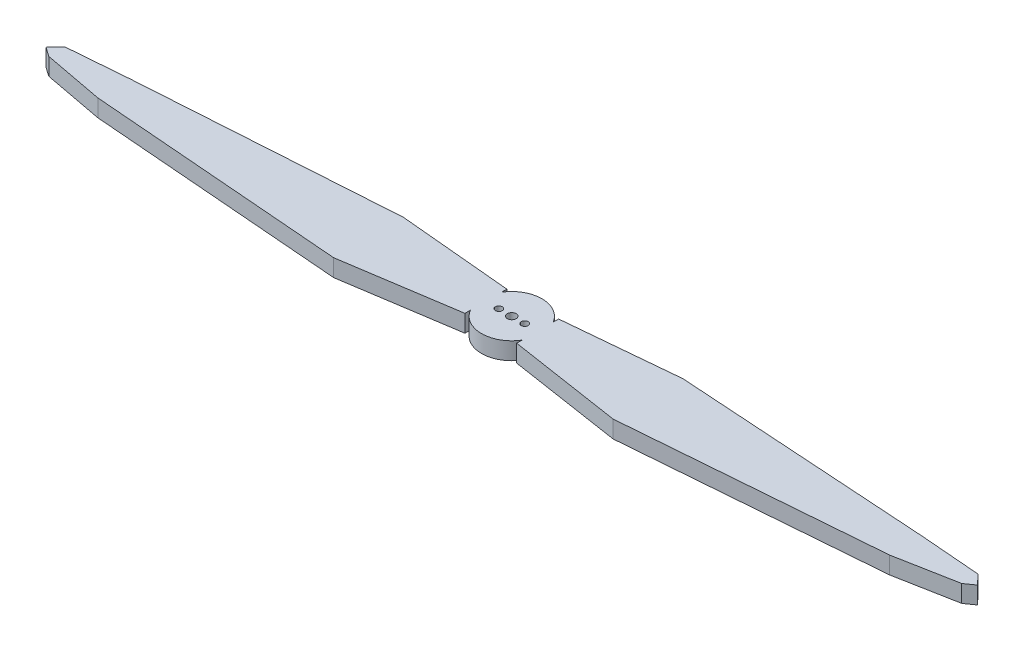
ISO-10303-21;
HEADER;
FILE_DESCRIPTION(('STEP AP214'),'2;1');
FILE_NAME('part.step','',(''),(''),'','','');
FILE_SCHEMA(('AUTOMOTIVE_DESIGN { 1 0 10303 214 1 1 1 1 }'));
ENDSEC;
DATA;
#1=APPLICATION_CONTEXT('core data for automotive mechanical design processes');
#2=APPLICATION_PROTOCOL_DEFINITION('international standard','automotive_design',2000,#1);
#3=PRODUCT_CONTEXT('',#1,'mechanical');
#4=PRODUCT('Part','Part','',(#3));
#5=PRODUCT_RELATED_PRODUCT_CATEGORY('part','',(#4));
#6=PRODUCT_DEFINITION_FORMATION('','',#4);
#7=PRODUCT_DEFINITION_CONTEXT('part definition',#1,'design');
#8=PRODUCT_DEFINITION('design','',#6,#7);
#9=PRODUCT_DEFINITION_SHAPE('','',#8);
#10=(LENGTH_UNIT() NAMED_UNIT(*) SI_UNIT(.MILLI.,.METRE.));
#11=(NAMED_UNIT(*) PLANE_ANGLE_UNIT() SI_UNIT($,.RADIAN.));
#12=(NAMED_UNIT(*) SI_UNIT($,.STERADIAN.) SOLID_ANGLE_UNIT());
#13=UNCERTAINTY_MEASURE_WITH_UNIT(LENGTH_MEASURE(1.E-05),#10,'distance_accuracy_value','');
#14=(GEOMETRIC_REPRESENTATION_CONTEXT(3) GLOBAL_UNCERTAINTY_ASSIGNED_CONTEXT((#13)) GLOBAL_UNIT_ASSIGNED_CONTEXT((#10,
#11,#12)) REPRESENTATION_CONTEXT('',''));
#15=CARTESIAN_POINT('',(0.,0.,0.));
#16=DIRECTION('',(0.,0.,1.));
#17=DIRECTION('',(1.,0.,0.));
#18=AXIS2_PLACEMENT_3D('',#15,#16,#17);
#19=CARTESIAN_POINT('',(0.,8.,0.));
#20=DIRECTION('',(0.,-1.,0.));
#21=DIRECTION('',(0.,0.,-1.));
#22=AXIS2_PLACEMENT_3D('',#19,#20,#21);
#23=CYLINDRICAL_SURFACE('',#22,14.);
#24=DIRECTION('',(0.,-1.,0.));
#25=VECTOR('',#24,1.);
#26=CARTESIAN_POINT('',(-12.,8.,-7.21110255092798));
#27=LINE('',#26,#25);
#28=CARTESIAN_POINT('',(-12.,8.,-7.21110255092798));
#29=VERTEX_POINT('',#28);
#30=CARTESIAN_POINT('',(-12.,0.,-7.21110255092798));
#31=VERTEX_POINT('',#30);
#32=EDGE_CURVE('E11',#29,#31,#27,.T.);
#33=ORIENTED_EDGE('',*,*,#32,.F.);
#34=CARTESIAN_POINT('',(0.,8.,0.));
#35=DIRECTION('',(0.,1.,0.));
#36=DIRECTION('',(0.,0.,1.));
#37=AXIS2_PLACEMENT_3D('',#34,#35,#36);
#38=CIRCLE('',#37,14.);
#39=CARTESIAN_POINT('',(12.,8.,-7.21110255092798));
#40=VERTEX_POINT('',#39);
#41=EDGE_CURVE('E241',#40,#29,#38,.T.);
#42=ORIENTED_EDGE('',*,*,#41,.F.);
#43=DIRECTION('',(0.,-1.,0.));
#44=VECTOR('',#43,1.);
#45=CARTESIAN_POINT('',(12.,8.,-7.21110255092798));
#46=LINE('',#45,#44);
#47=CARTESIAN_POINT('',(12.,0.,-7.21110255092798));
#48=VERTEX_POINT('',#47);
#49=EDGE_CURVE('E242',#40,#48,#46,.T.);
#50=ORIENTED_EDGE('',*,*,#49,.T.);
#51=CARTESIAN_POINT('',(0.,0.,0.));
#52=DIRECTION('',(0.,1.,0.));
#53=DIRECTION('',(0.,0.,1.));
#54=AXIS2_PLACEMENT_3D('',#51,#52,#53);
#55=CIRCLE('',#54,14.);
#56=EDGE_CURVE('E218',#48,#31,#55,.T.);
#57=ORIENTED_EDGE('',*,*,#56,.T.);
#58=EDGE_LOOP('',(#33,#42,#50,#57));
#59=FACE_BOUND('',#58,.T.);
#60=ADVANCED_FACE('F39',(#59),#23,.T.);
#61=DIRECTION('',(0.,-1.,0.));
#62=VECTOR('',#61,1.);
#63=CARTESIAN_POINT('',(-12.,8.,7.21110255092798));
#64=LINE('',#63,#62);
#65=CARTESIAN_POINT('',(-12.,0.,7.21110255092798));
#66=VERTEX_POINT('',#65);
#67=CARTESIAN_POINT('',(-12.,8.,7.21110255092798));
#68=VERTEX_POINT('',#67);
#69=EDGE_CURVE('E48',#66,#68,#64,.F.);
#70=ORIENTED_EDGE('',*,*,#69,.F.);
#71=CARTESIAN_POINT('',(12.,0.,7.21110255092798));
#72=VERTEX_POINT('',#71);
#73=EDGE_CURVE('E215',#66,#72,#55,.T.);
#74=ORIENTED_EDGE('',*,*,#73,.T.);
#75=DIRECTION('',(0.,-1.,0.));
#76=VECTOR('',#75,1.);
#77=CARTESIAN_POINT('',(12.,8.,7.21110255092798));
#78=LINE('',#77,#76);
#79=CARTESIAN_POINT('',(12.,8.,7.21110255092798));
#80=VERTEX_POINT('',#79);
#81=EDGE_CURVE('E246',#72,#80,#78,.F.);
#82=ORIENTED_EDGE('',*,*,#81,.T.);
#83=EDGE_CURVE('E56',#68,#80,#38,.T.);
#84=ORIENTED_EDGE('',*,*,#83,.F.);
#85=EDGE_LOOP('',(#70,#74,#82,#84));
#86=FACE_BOUND('',#85,.T.);
#87=ADVANCED_FACE('F437',(#86),#23,.T.);
#88=CARTESIAN_POINT('',(12.,8.,-9.7155));
#89=DIRECTION('',(1.,0.,0.));
#90=DIRECTION('',(0.,0.,-1.));
#91=AXIS2_PLACEMENT_3D('',#88,#89,#90);
#92=PLANE('',#91);
#93=ORIENTED_EDGE('',*,*,#81,.F.);
#94=DIRECTION('',(0.,0.,1.));
#95=VECTOR('',#94,1.);
#96=CARTESIAN_POINT('',(12.,0.,-9.7155));
#97=LINE('',#96,#95);
#98=CARTESIAN_POINT('',(12.,0.,9.7155));
#99=VERTEX_POINT('',#98);
#100=EDGE_CURVE('E248',#72,#99,#97,.T.);
#101=ORIENTED_EDGE('',*,*,#100,.T.);
#102=DIRECTION('',(0.,-1.,0.));
#103=VECTOR('',#102,1.);
#104=CARTESIAN_POINT('',(12.,8.,9.7155));
#105=LINE('',#104,#103);
#106=CARTESIAN_POINT('',(12.,8.,9.7155));
#107=VERTEX_POINT('',#106);
#108=EDGE_CURVE('E311',#107,#99,#105,.T.);
#109=ORIENTED_EDGE('',*,*,#108,.F.);
#110=DIRECTION('',(0.,0.,1.));
#111=VECTOR('',#110,1.);
#112=CARTESIAN_POINT('',(12.,8.,-9.7155));
#113=LINE('',#112,#111);
#114=EDGE_CURVE('E253',#80,#107,#113,.T.);
#115=ORIENTED_EDGE('',*,*,#114,.F.);
#116=EDGE_LOOP('',(#93,#101,#109,#115));
#117=FACE_BOUND('',#116,.T.);
#118=ADVANCED_FACE('F41',(#117),#92,.F.);
#119=ORIENTED_EDGE('',*,*,#49,.F.);
#120=CARTESIAN_POINT('',(12.,8.,-9.7155));
#121=VERTEX_POINT('',#120);
#122=EDGE_CURVE('E249',#121,#40,#113,.T.);
#123=ORIENTED_EDGE('',*,*,#122,.F.);
#124=DIRECTION('',(0.,-1.,0.));
#125=VECTOR('',#124,1.);
#126=CARTESIAN_POINT('',(12.,8.,-9.7155));
#127=LINE('',#126,#125);
#128=CARTESIAN_POINT('',(12.,0.,-9.7155));
#129=VERTEX_POINT('',#128);
#130=EDGE_CURVE('E269',#121,#129,#127,.T.);
#131=ORIENTED_EDGE('',*,*,#130,.T.);
#132=EDGE_CURVE('E270',#129,#48,#97,.T.);
#133=ORIENTED_EDGE('',*,*,#132,.T.);
#134=EDGE_LOOP('',(#119,#123,#131,#133));
#135=FACE_BOUND('',#134,.T.);
#136=ADVANCED_FACE('F393',(#135),#92,.F.);
#137=CARTESIAN_POINT('',(12.,8.,9.7155));
#138=DIRECTION('',(0.151650746893093,0.,-0.988434140935433));
#139=DIRECTION('',(-0.988434140935433,0.,-0.151650746893093));
#140=AXIS2_PLACEMENT_3D('',#137,#138,#139);
#141=PLANE('',#140);
#142=DIRECTION('',(0.988434140935433,0.,0.151650746893093));
#143=VECTOR('',#142,1.);
#144=CARTESIAN_POINT('',(12.,0.,9.7155));
#145=LINE('',#144,#143);
#146=CARTESIAN_POINT('',(64.77,0.,17.81175));
#147=VERTEX_POINT('',#146);
#148=EDGE_CURVE('E272',#99,#147,#145,.T.);
#149=ORIENTED_EDGE('',*,*,#148,.T.);
#150=DIRECTION('',(0.,-1.,0.));
#151=VECTOR('',#150,1.);
#152=CARTESIAN_POINT('',(64.77,8.,17.81175));
#153=LINE('',#152,#151);
#154=CARTESIAN_POINT('',(64.77,8.,17.81175));
#155=VERTEX_POINT('',#154);
#156=EDGE_CURVE('E308',#155,#147,#153,.T.);
#157=ORIENTED_EDGE('',*,*,#156,.F.);
#158=DIRECTION('',(0.988434140935433,0.,0.151650746893093));
#159=VECTOR('',#158,1.);
#160=CARTESIAN_POINT('',(12.,8.,9.7155));
#161=LINE('',#160,#159);
#162=EDGE_CURVE('E252',#107,#155,#161,.T.);
#163=ORIENTED_EDGE('',*,*,#162,.F.);
#164=ORIENTED_EDGE('',*,*,#108,.T.);
#165=EDGE_LOOP('',(#149,#157,#163,#164));
#166=FACE_BOUND('',#165,.T.);
#167=ADVANCED_FACE('F434',(#166),#141,.F.);
#168=CARTESIAN_POINT('',(64.77,8.,17.81175));
#169=DIRECTION('',(-0.07974522228289,0.,-0.996815278536125));
#170=DIRECTION('',(-0.996815278536125,0.,0.07974522228289));
#171=AXIS2_PLACEMENT_3D('',#168,#169,#170);
#172=PLANE('',#171);
#173=DIRECTION('',(0.996815278536125,0.,-0.07974522228289));
#174=VECTOR('',#173,1.);
#175=CARTESIAN_POINT('',(64.77,0.,17.81175));
#176=LINE('',#175,#174);
#177=CARTESIAN_POINT('',(183.515,0.,8.31215));
#178=VERTEX_POINT('',#177);
#179=EDGE_CURVE('E274',#147,#178,#176,.T.);
#180=ORIENTED_EDGE('',*,*,#179,.T.);
#181=DIRECTION('',(0.,-1.,0.));
#182=VECTOR('',#181,1.);
#183=CARTESIAN_POINT('',(183.515,8.,8.31215));
#184=LINE('',#183,#182);
#185=CARTESIAN_POINT('',(183.515,8.,8.31215));
#186=VERTEX_POINT('',#185);
#187=EDGE_CURVE('E305',#186,#178,#184,.T.);
#188=ORIENTED_EDGE('',*,*,#187,.F.);
#189=DIRECTION('',(0.996815278536125,0.,-0.07974522228289));
#190=VECTOR('',#189,1.);
#191=CARTESIAN_POINT('',(64.77,8.,17.81175));
#192=LINE('',#191,#190);
#193=EDGE_CURVE('E255',#155,#186,#192,.T.);
#194=ORIENTED_EDGE('',*,*,#193,.F.);
#195=ORIENTED_EDGE('',*,*,#156,.T.);
#196=EDGE_LOOP('',(#180,#188,#194,#195));
#197=FACE_BOUND('',#196,.T.);
#198=ADVANCED_FACE('F427',(#197),#172,.F.);
#199=CARTESIAN_POINT('',(183.515,8.,8.31215));
#200=DIRECTION('',(-0.185201268913039,0.,-0.982700610558984));
#201=DIRECTION('',(-0.982700610558984,0.,0.185201268913039));
#202=AXIS2_PLACEMENT_3D('',#199,#200,#201);
#203=PLANE('',#202);
#204=DIRECTION('',(0.982700610558984,0.,-0.185201268913039));
#205=VECTOR('',#204,1.);
#206=CARTESIAN_POINT('',(183.515,0.,8.31215));
#207=LINE('',#206,#205);
#208=CARTESIAN_POINT('',(211.582,0.,3.0226));
#209=VERTEX_POINT('',#208);
#210=EDGE_CURVE('E276',#178,#209,#207,.T.);
#211=ORIENTED_EDGE('',*,*,#210,.T.);
#212=DIRECTION('',(0.,-1.,0.));
#213=VECTOR('',#212,1.);
#214=CARTESIAN_POINT('',(211.582,8.,3.0226));
#215=LINE('',#214,#213);
#216=CARTESIAN_POINT('',(211.582,8.,3.0226));
#217=VERTEX_POINT('',#216);
#218=EDGE_CURVE('E302',#217,#209,#215,.T.);
#219=ORIENTED_EDGE('',*,*,#218,.F.);
#220=DIRECTION('',(0.982700610558984,0.,-0.185201268913039));
#221=VECTOR('',#220,1.);
#222=CARTESIAN_POINT('',(183.515,8.,8.31215));
#223=LINE('',#222,#221);
#224=EDGE_CURVE('E257',#186,#217,#223,.T.);
#225=ORIENTED_EDGE('',*,*,#224,.F.);
#226=ORIENTED_EDGE('',*,*,#187,.T.);
#227=EDGE_LOOP('',(#211,#219,#225,#226));
#228=FACE_BOUND('',#227,.T.);
#229=ADVANCED_FACE('F423',(#228),#203,.F.);
#230=CARTESIAN_POINT('',(211.582,8.,3.0226));
#231=DIRECTION('',(-0.573462344363327,0.,-0.819231920519042));
#232=DIRECTION('',(-0.819231920519042,0.,0.573462344363327));
#233=AXIS2_PLACEMENT_3D('',#230,#231,#232);
#234=PLANE('',#233);
#235=DIRECTION('',(0.819231920519041,0.,-0.573462344363327));
#236=VECTOR('',#235,1.);
#237=CARTESIAN_POINT('',(211.582,0.,3.0226));
#238=LINE('',#237,#236);
#239=CARTESIAN_POINT('',(215.9,0.,0.));
#240=VERTEX_POINT('',#239);
#241=EDGE_CURVE('E278',#209,#240,#238,.T.);
#242=ORIENTED_EDGE('',*,*,#241,.T.);
#243=DIRECTION('',(0.,-1.,0.));
#244=VECTOR('',#243,1.);
#245=CARTESIAN_POINT('',(215.9,8.,0.));
#246=LINE('',#245,#244);
#247=CARTESIAN_POINT('',(215.9,8.,0.));
#248=VERTEX_POINT('',#247);
#249=EDGE_CURVE('E299',#248,#240,#246,.T.);
#250=ORIENTED_EDGE('',*,*,#249,.F.);
#251=DIRECTION('',(0.819231920519041,0.,-0.573462344363327));
#252=VECTOR('',#251,1.);
#253=CARTESIAN_POINT('',(211.582,8.,3.0226));
#254=LINE('',#253,#252);
#255=EDGE_CURVE('E259',#217,#248,#254,.T.);
#256=ORIENTED_EDGE('',*,*,#255,.F.);
#257=ORIENTED_EDGE('',*,*,#218,.T.);
#258=EDGE_LOOP('',(#242,#250,#256,#257));
#259=FACE_BOUND('',#258,.T.);
#260=ADVANCED_FACE('F418',(#259),#234,.F.);
#261=CARTESIAN_POINT('',(215.9,8.,0.));
#262=DIRECTION('',(-0.724137931034482,0.,0.689655172413794));
#263=DIRECTION('',(0.689655172413794,0.,0.724137931034482));
#264=AXIS2_PLACEMENT_3D('',#261,#262,#263);
#265=PLANE('',#264);
#266=DIRECTION('',(-0.689655172413794,0.,-0.724137931034482));
#267=VECTOR('',#266,1.);
#268=CARTESIAN_POINT('',(215.9,0.,0.));
#269=LINE('',#268,#267);
#270=CARTESIAN_POINT('',(211.582,0.,-4.5339));
#271=VERTEX_POINT('',#270);
#272=EDGE_CURVE('E280',#240,#271,#269,.T.);
#273=ORIENTED_EDGE('',*,*,#272,.T.);
#274=DIRECTION('',(0.,-1.,0.));
#275=VECTOR('',#274,1.);
#276=CARTESIAN_POINT('',(211.582,8.,-4.5339));
#277=LINE('',#276,#275);
#278=CARTESIAN_POINT('',(211.582,8.,-4.5339));
#279=VERTEX_POINT('',#278);
#280=EDGE_CURVE('E296',#279,#271,#277,.T.);
#281=ORIENTED_EDGE('',*,*,#280,.F.);
#282=DIRECTION('',(-0.689655172413794,0.,-0.724137931034482));
#283=VECTOR('',#282,1.);
#284=CARTESIAN_POINT('',(215.9,8.,0.));
#285=LINE('',#284,#283);
#286=EDGE_CURVE('E261',#248,#279,#285,.T.);
#287=ORIENTED_EDGE('',*,*,#286,.F.);
#288=ORIENTED_EDGE('',*,*,#249,.T.);
#289=EDGE_LOOP('',(#273,#281,#287,#288));
#290=FACE_BOUND('',#289,.T.);
#291=ADVANCED_FACE('F412',(#290),#265,.F.);
#292=CARTESIAN_POINT('',(211.582,8.,-4.5339));
#293=DIRECTION('',(-0.0805070569764701,0.,0.996754038756296));
#294=DIRECTION('',(0.996754038756296,0.,0.0805070569764701));
#295=AXIS2_PLACEMENT_3D('',#292,#293,#294);
#296=PLANE('',#295);
#297=DIRECTION('',(-0.996754038756296,0.,-0.0805070569764701));
#298=VECTOR('',#297,1.);
#299=CARTESIAN_POINT('',(211.582,0.,-4.5339));
#300=LINE('',#299,#298);
#301=CARTESIAN_POINT('',(183.515,0.,-6.80085));
#302=VERTEX_POINT('',#301);
#303=EDGE_CURVE('E282',#271,#302,#300,.T.);
#304=ORIENTED_EDGE('',*,*,#303,.T.);
#305=DIRECTION('',(0.,-1.,0.));
#306=VECTOR('',#305,1.);
#307=CARTESIAN_POINT('',(183.515,8.,-6.80085));
#308=LINE('',#307,#306);
#309=CARTESIAN_POINT('',(183.515,8.,-6.80085));
#310=VERTEX_POINT('',#309);
#311=EDGE_CURVE('E293',#310,#302,#308,.T.);
#312=ORIENTED_EDGE('',*,*,#311,.F.);
#313=DIRECTION('',(-0.996754038756296,0.,-0.0805070569764701));
#314=VECTOR('',#313,1.);
#315=CARTESIAN_POINT('',(211.582,8.,-4.5339));
#316=LINE('',#315,#314);
#317=EDGE_CURVE('E263',#279,#310,#316,.T.);
#318=ORIENTED_EDGE('',*,*,#317,.F.);
#319=ORIENTED_EDGE('',*,*,#280,.T.);
#320=EDGE_LOOP('',(#304,#312,#318,#319));
#321=FACE_BOUND('',#320,.T.);
#322=ADVANCED_FACE('F408',(#321),#296,.F.);
#323=CARTESIAN_POINT('',(183.515,8.,-6.80085));
#324=DIRECTION('',(-0.0653147810154766,0.,0.99786470995867));
#325=DIRECTION('',(0.99786470995867,0.,0.0653147810154766));
#326=AXIS2_PLACEMENT_3D('',#323,#324,#325);
#327=PLANE('',#326);
#328=DIRECTION('',(-0.99786470995867,0.,-0.0653147810154766));
#329=VECTOR('',#328,1.);
#330=CARTESIAN_POINT('',(183.515,0.,-6.80085));
#331=LINE('',#330,#329);
#332=CARTESIAN_POINT('',(64.77,0.,-14.57325));
#333=VERTEX_POINT('',#332);
#334=EDGE_CURVE('E284',#302,#333,#331,.T.);
#335=ORIENTED_EDGE('',*,*,#334,.T.);
#336=DIRECTION('',(0.,-1.,0.));
#337=VECTOR('',#336,1.);
#338=CARTESIAN_POINT('',(64.77,8.,-14.57325));
#339=LINE('',#338,#337);
#340=CARTESIAN_POINT('',(64.77,8.,-14.57325));
#341=VERTEX_POINT('',#340);
#342=EDGE_CURVE('E290',#341,#333,#339,.T.);
#343=ORIENTED_EDGE('',*,*,#342,.F.);
#344=DIRECTION('',(-0.99786470995867,0.,-0.0653147810154766));
#345=VECTOR('',#344,1.);
#346=CARTESIAN_POINT('',(183.515,8.,-6.80085));
#347=LINE('',#346,#345);
#348=EDGE_CURVE('E265',#310,#341,#347,.T.);
#349=ORIENTED_EDGE('',*,*,#348,.F.);
#350=ORIENTED_EDGE('',*,*,#311,.T.);
#351=EDGE_LOOP('',(#335,#343,#349,#350));
#352=FACE_BOUND('',#351,.T.);
#353=ADVANCED_FACE('F404',(#352),#327,.F.);
#354=CARTESIAN_POINT('',(64.77,8.,-14.57325));
#355=DIRECTION('',(0.0916675620231843,0.,0.995789665578392));
#356=DIRECTION('',(0.995789665578392,0.,-0.0916675620231843));
#357=AXIS2_PLACEMENT_3D('',#354,#355,#356);
#358=PLANE('',#357);
#359=DIRECTION('',(-0.995789665578392,0.,0.0916675620231843));
#360=VECTOR('',#359,1.);
#361=CARTESIAN_POINT('',(64.77,0.,-14.57325));
#362=LINE('',#361,#360);
#363=EDGE_CURVE('E286',#333,#129,#362,.T.);
#364=ORIENTED_EDGE('',*,*,#363,.T.);
#365=ORIENTED_EDGE('',*,*,#130,.F.);
#366=DIRECTION('',(-0.995789665578392,0.,0.0916675620231843));
#367=VECTOR('',#366,1.);
#368=CARTESIAN_POINT('',(64.77,8.,-14.57325));
#369=LINE('',#368,#367);
#370=EDGE_CURVE('E267',#341,#121,#369,.T.);
#371=ORIENTED_EDGE('',*,*,#370,.F.);
#372=ORIENTED_EDGE('',*,*,#342,.T.);
#373=EDGE_LOOP('',(#364,#365,#371,#372));
#374=FACE_BOUND('',#373,.T.);
#375=ADVANCED_FACE('F399',(#374),#358,.F.);
#376=CARTESIAN_POINT('',(0.,8.,0.));
#377=DIRECTION('',(0.,-1.,0.));
#378=DIRECTION('',(0.,0.,-1.));
#379=AXIS2_PLACEMENT_3D('',#376,#377,#378);
#380=PLANE('',#379);
#381=CARTESIAN_POINT('',(-6.,8.,0.));
#382=DIRECTION('',(0.,1.,0.));
#383=DIRECTION('',(0.,0.,1.));
#384=AXIS2_PLACEMENT_3D('',#381,#382,#383);
#385=CIRCLE('',#384,1.6);
#386=CARTESIAN_POINT('',(-6.,8.,1.6));
#387=VERTEX_POINT('',#386);
#388=EDGE_CURVE('E680',#387,#387,#385,.T.);
#389=ORIENTED_EDGE('',*,*,#388,.F.);
#390=EDGE_LOOP('',(#389));
#391=FACE_BOUND('',#390,.T.);
#392=CARTESIAN_POINT('',(6.,8.,0.));
#393=DIRECTION('',(0.,1.,0.));
#394=DIRECTION('',(0.,0.,1.));
#395=AXIS2_PLACEMENT_3D('',#392,#393,#394);
#396=CIRCLE('',#395,1.6);
#397=CARTESIAN_POINT('',(6.,8.,1.6));
#398=VERTEX_POINT('',#397);
#399=EDGE_CURVE('E681',#398,#398,#396,.T.);
#400=ORIENTED_EDGE('',*,*,#399,.F.);
#401=EDGE_LOOP('',(#400));
#402=FACE_BOUND('',#401,.T.);
#403=CARTESIAN_POINT('',(0.,8.,0.));
#404=DIRECTION('',(0.,1.,0.));
#405=DIRECTION('',(0.,0.,1.));
#406=AXIS2_PLACEMENT_3D('',#403,#404,#405);
#407=CIRCLE('',#406,2.05);
#408=CARTESIAN_POINT('',(0.,8.,2.05));
#409=VERTEX_POINT('',#408);
#410=EDGE_CURVE('E318',#409,#409,#407,.T.);
#411=ORIENTED_EDGE('',*,*,#410,.F.);
#412=EDGE_LOOP('',(#411));
#413=FACE_BOUND('',#412,.T.);
#414=DIRECTION('',(0.,0.,-1.));
#415=VECTOR('',#414,1.);
#416=CARTESIAN_POINT('',(-12.,8.,-9.7155));
#417=LINE('',#416,#415);
#418=CARTESIAN_POINT('',(-12.,8.,9.7155));
#419=VERTEX_POINT('',#418);
#420=EDGE_CURVE('E203',#419,#68,#417,.T.);
#421=ORIENTED_EDGE('',*,*,#420,.T.);
#422=ORIENTED_EDGE('',*,*,#83,.T.);
#423=ORIENTED_EDGE('',*,*,#114,.T.);
#424=ORIENTED_EDGE('',*,*,#162,.T.);
#425=ORIENTED_EDGE('',*,*,#193,.T.);
#426=ORIENTED_EDGE('',*,*,#224,.T.);
#427=ORIENTED_EDGE('',*,*,#255,.T.);
#428=ORIENTED_EDGE('',*,*,#286,.T.);
#429=ORIENTED_EDGE('',*,*,#317,.T.);
#430=ORIENTED_EDGE('',*,*,#348,.T.);
#431=ORIENTED_EDGE('',*,*,#370,.T.);
#432=ORIENTED_EDGE('',*,*,#122,.T.);
#433=ORIENTED_EDGE('',*,*,#41,.T.);
#434=CARTESIAN_POINT('',(-12.,8.,-9.7155));
#435=VERTEX_POINT('',#434);
#436=EDGE_CURVE('E239',#29,#435,#417,.T.);
#437=ORIENTED_EDGE('',*,*,#436,.T.);
#438=DIRECTION('',(-0.995789665578392,0.,-0.0916675620231843));
#439=VECTOR('',#438,1.);
#440=CARTESIAN_POINT('',(-64.77,8.,-14.57325));
#441=LINE('',#440,#439);
#442=CARTESIAN_POINT('',(-64.77,8.,-14.57325));
#443=VERTEX_POINT('',#442);
#444=EDGE_CURVE('E237',#435,#443,#441,.T.);
#445=ORIENTED_EDGE('',*,*,#444,.T.);
#446=DIRECTION('',(-0.99786470995867,0.,0.0653147810154766));
#447=VECTOR('',#446,1.);
#448=CARTESIAN_POINT('',(-183.515,8.,-6.80085));
#449=LINE('',#448,#447);
#450=CARTESIAN_POINT('',(-183.515,8.,-6.80085));
#451=VERTEX_POINT('',#450);
#452=EDGE_CURVE('E235',#443,#451,#449,.T.);
#453=ORIENTED_EDGE('',*,*,#452,.T.);
#454=DIRECTION('',(-0.996754038756296,0.,0.0805070569764701));
#455=VECTOR('',#454,1.);
#456=CARTESIAN_POINT('',(-211.582,8.,-4.5339));
#457=LINE('',#456,#455);
#458=CARTESIAN_POINT('',(-211.582,8.,-4.5339));
#459=VERTEX_POINT('',#458);
#460=EDGE_CURVE('E233',#451,#459,#457,.T.);
#461=ORIENTED_EDGE('',*,*,#460,.T.);
#462=DIRECTION('',(-0.689655172413794,0.,0.724137931034482));
#463=VECTOR('',#462,1.);
#464=CARTESIAN_POINT('',(-215.9,8.,0.));
#465=LINE('',#464,#463);
#466=CARTESIAN_POINT('',(-215.9,8.,0.));
#467=VERTEX_POINT('',#466);
#468=EDGE_CURVE('E231',#459,#467,#465,.T.);
#469=ORIENTED_EDGE('',*,*,#468,.T.);
#470=DIRECTION('',(0.819231920519041,0.,0.573462344363327));
#471=VECTOR('',#470,1.);
#472=CARTESIAN_POINT('',(-211.582,8.,3.0226));
#473=LINE('',#472,#471);
#474=CARTESIAN_POINT('',(-211.582,8.,3.0226));
#475=VERTEX_POINT('',#474);
#476=EDGE_CURVE('E229',#467,#475,#473,.T.);
#477=ORIENTED_EDGE('',*,*,#476,.T.);
#478=DIRECTION('',(0.982700610558984,0.,0.185201268913039));
#479=VECTOR('',#478,1.);
#480=CARTESIAN_POINT('',(-183.515,8.,8.31215));
#481=LINE('',#480,#479);
#482=CARTESIAN_POINT('',(-183.515,8.,8.31215));
#483=VERTEX_POINT('',#482);
#484=EDGE_CURVE('E227',#475,#483,#481,.T.);
#485=ORIENTED_EDGE('',*,*,#484,.T.);
#486=DIRECTION('',(0.996815278536125,0.,0.07974522228289));
#487=VECTOR('',#486,1.);
#488=CARTESIAN_POINT('',(-64.77,8.,17.81175));
#489=LINE('',#488,#487);
#490=CARTESIAN_POINT('',(-64.77,8.,17.81175));
#491=VERTEX_POINT('',#490);
#492=EDGE_CURVE('E225',#483,#491,#489,.T.);
#493=ORIENTED_EDGE('',*,*,#492,.T.);
#494=DIRECTION('',(0.988434140935433,0.,-0.151650746893093));
#495=VECTOR('',#494,1.);
#496=CARTESIAN_POINT('',(-12.,8.,9.7155));
#497=LINE('',#496,#495);
#498=EDGE_CURVE('E210',#491,#419,#497,.T.);
#499=ORIENTED_EDGE('',*,*,#498,.T.);
#500=EDGE_LOOP('',(#421,#422,#423,#424,#425,#426,#427,#428,#429,#430,#431,#432,#433,#437,#445,
#453,#461,#469,#477,#485,#493,#499));
#501=FACE_BOUND('',#500,.T.);
#502=ADVANCED_FACE('F383',(#391,#402,#413,#501),#380,.F.);
#503=CARTESIAN_POINT('',(0.,0.,0.));
#504=DIRECTION('',(0.,-1.,0.));
#505=DIRECTION('',(0.,0.,-1.));
#506=AXIS2_PLACEMENT_3D('',#503,#504,#505);
#507=PLANE('',#506);
#508=CARTESIAN_POINT('',(-6.,0.,0.));
#509=DIRECTION('',(0.,-1.,0.));
#510=DIRECTION('',(0.,0.,-1.));
#511=AXIS2_PLACEMENT_3D('',#508,#509,#510);
#512=CIRCLE('',#511,1.6);
#513=CARTESIAN_POINT('',(-6.,0.,1.6));
#514=VERTEX_POINT('',#513);
#515=EDGE_CURVE('E43',#514,#514,#512,.T.);
#516=ORIENTED_EDGE('',*,*,#515,.F.);
#517=EDGE_LOOP('',(#516));
#518=FACE_BOUND('',#517,.T.);
#519=CARTESIAN_POINT('',(6.,0.,0.));
#520=DIRECTION('',(0.,-1.,0.));
#521=DIRECTION('',(0.,0.,-1.));
#522=AXIS2_PLACEMENT_3D('',#519,#520,#521);
#523=CIRCLE('',#522,1.6);
#524=CARTESIAN_POINT('',(6.,0.,1.6));
#525=VERTEX_POINT('',#524);
#526=EDGE_CURVE('E317',#525,#525,#523,.T.);
#527=ORIENTED_EDGE('',*,*,#526,.F.);
#528=EDGE_LOOP('',(#527));
#529=FACE_BOUND('',#528,.T.);
#530=CARTESIAN_POINT('',(0.,0.,0.));
#531=DIRECTION('',(0.,-1.,0.));
#532=DIRECTION('',(0.,0.,-1.));
#533=AXIS2_PLACEMENT_3D('',#530,#531,#532);
#534=CIRCLE('',#533,2.05);
#535=CARTESIAN_POINT('',(0.,0.,2.05));
#536=VERTEX_POINT('',#535);
#537=EDGE_CURVE('E315',#536,#536,#534,.T.);
#538=ORIENTED_EDGE('',*,*,#537,.F.);
#539=EDGE_LOOP('',(#538));
#540=FACE_BOUND('',#539,.T.);
#541=DIRECTION('',(0.,0.,-1.));
#542=VECTOR('',#541,1.);
#543=CARTESIAN_POINT('',(-12.,0.,-9.7155));
#544=LINE('',#543,#542);
#545=CARTESIAN_POINT('',(-12.,0.,-9.7155));
#546=VERTEX_POINT('',#545);
#547=EDGE_CURVE('E216',#31,#546,#544,.T.);
#548=ORIENTED_EDGE('',*,*,#547,.F.);
#549=ORIENTED_EDGE('',*,*,#56,.F.);
#550=ORIENTED_EDGE('',*,*,#132,.F.);
#551=ORIENTED_EDGE('',*,*,#363,.F.);
#552=ORIENTED_EDGE('',*,*,#334,.F.);
#553=ORIENTED_EDGE('',*,*,#303,.F.);
#554=ORIENTED_EDGE('',*,*,#272,.F.);
#555=ORIENTED_EDGE('',*,*,#241,.F.);
#556=ORIENTED_EDGE('',*,*,#210,.F.);
#557=ORIENTED_EDGE('',*,*,#179,.F.);
#558=ORIENTED_EDGE('',*,*,#148,.F.);
#559=ORIENTED_EDGE('',*,*,#100,.F.);
#560=ORIENTED_EDGE('',*,*,#73,.F.);
#561=CARTESIAN_POINT('',(-12.,0.,9.7155));
#562=VERTEX_POINT('',#561);
#563=EDGE_CURVE('E208',#562,#66,#544,.T.);
#564=ORIENTED_EDGE('',*,*,#563,.F.);
#565=DIRECTION('',(0.988434140935433,0.,-0.151650746893093));
#566=VECTOR('',#565,1.);
#567=CARTESIAN_POINT('',(-12.,0.,9.7155));
#568=LINE('',#567,#566);
#569=CARTESIAN_POINT('',(-64.77,0.,17.81175));
#570=VERTEX_POINT('',#569);
#571=EDGE_CURVE('E191',#570,#562,#568,.T.);
#572=ORIENTED_EDGE('',*,*,#571,.F.);
#573=DIRECTION('',(0.996815278536125,0.,0.07974522228289));
#574=VECTOR('',#573,1.);
#575=CARTESIAN_POINT('',(-64.77,0.,17.81175));
#576=LINE('',#575,#574);
#577=CARTESIAN_POINT('',(-183.515,0.,8.31215));
#578=VERTEX_POINT('',#577);
#579=EDGE_CURVE('E202',#578,#570,#576,.T.);
#580=ORIENTED_EDGE('',*,*,#579,.F.);
#581=DIRECTION('',(0.982700610558984,0.,0.185201268913039));
#582=VECTOR('',#581,1.);
#583=CARTESIAN_POINT('',(-183.515,0.,8.31215));
#584=LINE('',#583,#582);
#585=CARTESIAN_POINT('',(-211.582,0.,3.0226));
#586=VERTEX_POINT('',#585);
#587=EDGE_CURVE('E354',#586,#578,#584,.T.);
#588=ORIENTED_EDGE('',*,*,#587,.F.);
#589=DIRECTION('',(0.819231920519041,0.,0.573462344363327));
#590=VECTOR('',#589,1.);
#591=CARTESIAN_POINT('',(-211.582,0.,3.0226));
#592=LINE('',#591,#590);
#593=CARTESIAN_POINT('',(-215.9,0.,0.));
#594=VERTEX_POINT('',#593);
#595=EDGE_CURVE('E356',#594,#586,#592,.T.);
#596=ORIENTED_EDGE('',*,*,#595,.F.);
#597=DIRECTION('',(-0.689655172413794,0.,0.724137931034482));
#598=VECTOR('',#597,1.);
#599=CARTESIAN_POINT('',(-215.9,0.,0.));
#600=LINE('',#599,#598);
#601=CARTESIAN_POINT('',(-211.582,0.,-4.5339));
#602=VERTEX_POINT('',#601);
#603=EDGE_CURVE('E358',#602,#594,#600,.T.);
#604=ORIENTED_EDGE('',*,*,#603,.F.);
#605=DIRECTION('',(-0.996754038756296,0.,0.0805070569764701));
#606=VECTOR('',#605,1.);
#607=CARTESIAN_POINT('',(-211.582,0.,-4.5339));
#608=LINE('',#607,#606);
#609=CARTESIAN_POINT('',(-183.515,0.,-6.80085));
#610=VERTEX_POINT('',#609);
#611=EDGE_CURVE('E360',#610,#602,#608,.T.);
#612=ORIENTED_EDGE('',*,*,#611,.F.);
#613=DIRECTION('',(-0.99786470995867,0.,0.0653147810154766));
#614=VECTOR('',#613,1.);
#615=CARTESIAN_POINT('',(-183.515,0.,-6.80085));
#616=LINE('',#615,#614);
#617=CARTESIAN_POINT('',(-64.77,0.,-14.57325));
#618=VERTEX_POINT('',#617);
#619=EDGE_CURVE('E361',#618,#610,#616,.T.);
#620=ORIENTED_EDGE('',*,*,#619,.F.);
#621=DIRECTION('',(-0.995789665578392,0.,-0.0916675620231843));
#622=VECTOR('',#621,1.);
#623=CARTESIAN_POINT('',(-64.77,0.,-14.57325));
#624=LINE('',#623,#622);
#625=EDGE_CURVE('E220',#546,#618,#624,.T.);
#626=ORIENTED_EDGE('',*,*,#625,.F.);
#627=EDGE_LOOP('',(#548,#549,#550,#551,#552,#553,#554,#555,#556,#557,#558,#559,#560,#564,#572,
#580,#588,#596,#604,#612,#620,#626));
#628=FACE_BOUND('',#627,.T.);
#629=ADVANCED_FACE('F213',(#518,#529,#540,#628),#507,.T.);
#630=CARTESIAN_POINT('',(-12.,8.,-9.7155));
#631=DIRECTION('',(-1.,0.,0.));
#632=DIRECTION('',(0.,0.,1.));
#633=AXIS2_PLACEMENT_3D('',#630,#631,#632);
#634=PLANE('',#633);
#635=ORIENTED_EDGE('',*,*,#436,.F.);
#636=ORIENTED_EDGE('',*,*,#32,.T.);
#637=ORIENTED_EDGE('',*,*,#547,.T.);
#638=DIRECTION('',(0.,-1.,0.));
#639=VECTOR('',#638,1.);
#640=CARTESIAN_POINT('',(-12.,8.,-9.7155));
#641=LINE('',#640,#639);
#642=EDGE_CURVE('E323',#435,#546,#641,.T.);
#643=ORIENTED_EDGE('',*,*,#642,.F.);
#644=EDGE_LOOP('',(#635,#636,#637,#643));
#645=FACE_BOUND('',#644,.T.);
#646=ADVANCED_FACE('F387',(#645),#634,.F.);
#647=ORIENTED_EDGE('',*,*,#563,.T.);
#648=ORIENTED_EDGE('',*,*,#69,.T.);
#649=ORIENTED_EDGE('',*,*,#420,.F.);
#650=DIRECTION('',(0.,-1.,0.));
#651=VECTOR('',#650,1.);
#652=CARTESIAN_POINT('',(-12.,8.,9.7155));
#653=LINE('',#652,#651);
#654=EDGE_CURVE('E195',#419,#562,#653,.T.);
#655=ORIENTED_EDGE('',*,*,#654,.T.);
#656=EDGE_LOOP('',(#647,#648,#649,#655));
#657=FACE_BOUND('',#656,.T.);
#658=ADVANCED_FACE('F207',(#657),#634,.F.);
#659=CARTESIAN_POINT('',(-64.77,8.,-14.57325));
#660=DIRECTION('',(-0.0916675620231843,0.,0.995789665578392));
#661=DIRECTION('',(0.995789665578392,0.,0.0916675620231843));
#662=AXIS2_PLACEMENT_3D('',#659,#660,#661);
#663=PLANE('',#662);
#664=ORIENTED_EDGE('',*,*,#625,.T.);
#665=DIRECTION('',(0.,-1.,0.));
#666=VECTOR('',#665,1.);
#667=CARTESIAN_POINT('',(-64.77,8.,-14.57325));
#668=LINE('',#667,#666);
#669=EDGE_CURVE('E327',#443,#618,#668,.T.);
#670=ORIENTED_EDGE('',*,*,#669,.F.);
#671=ORIENTED_EDGE('',*,*,#444,.F.);
#672=ORIENTED_EDGE('',*,*,#642,.T.);
#673=EDGE_LOOP('',(#664,#670,#671,#672));
#674=FACE_BOUND('',#673,.T.);
#675=ADVANCED_FACE('F367',(#674),#663,.F.);
#676=CARTESIAN_POINT('',(-183.515,8.,-6.80085));
#677=DIRECTION('',(0.0653147810154766,0.,0.99786470995867));
#678=DIRECTION('',(0.99786470995867,0.,-0.0653147810154766));
#679=AXIS2_PLACEMENT_3D('',#676,#677,#678);
#680=PLANE('',#679);
#681=ORIENTED_EDGE('',*,*,#619,.T.);
#682=DIRECTION('',(0.,-1.,0.));
#683=VECTOR('',#682,1.);
#684=CARTESIAN_POINT('',(-183.515,8.,-6.80085));
#685=LINE('',#684,#683);
#686=EDGE_CURVE('E333',#451,#610,#685,.T.);
#687=ORIENTED_EDGE('',*,*,#686,.F.);
#688=ORIENTED_EDGE('',*,*,#452,.F.);
#689=ORIENTED_EDGE('',*,*,#669,.T.);
#690=EDGE_LOOP('',(#681,#687,#688,#689));
#691=FACE_BOUND('',#690,.T.);
#692=ADVANCED_FACE('F369',(#691),#680,.F.);
#693=CARTESIAN_POINT('',(-211.582,8.,-4.5339));
#694=DIRECTION('',(0.0805070569764701,0.,0.996754038756296));
#695=DIRECTION('',(0.996754038756296,0.,-0.0805070569764701));
#696=AXIS2_PLACEMENT_3D('',#693,#694,#695);
#697=PLANE('',#696);
#698=ORIENTED_EDGE('',*,*,#611,.T.);
#699=DIRECTION('',(0.,-1.,0.));
#700=VECTOR('',#699,1.);
#701=CARTESIAN_POINT('',(-211.582,8.,-4.5339));
#702=LINE('',#701,#700);
#703=EDGE_CURVE('E340',#459,#602,#702,.T.);
#704=ORIENTED_EDGE('',*,*,#703,.F.);
#705=ORIENTED_EDGE('',*,*,#460,.F.);
#706=ORIENTED_EDGE('',*,*,#686,.T.);
#707=EDGE_LOOP('',(#698,#704,#705,#706));
#708=FACE_BOUND('',#707,.T.);
#709=ADVANCED_FACE('F375',(#708),#697,.F.);
#710=CARTESIAN_POINT('',(-215.9,8.,0.));
#711=DIRECTION('',(0.724137931034482,0.,0.689655172413794));
#712=DIRECTION('',(0.689655172413794,0.,-0.724137931034482));
#713=AXIS2_PLACEMENT_3D('',#710,#711,#712);
#714=PLANE('',#713);
#715=ORIENTED_EDGE('',*,*,#603,.T.);
#716=DIRECTION('',(0.,-1.,0.));
#717=VECTOR('',#716,1.);
#718=CARTESIAN_POINT('',(-215.9,8.,0.));
#719=LINE('',#718,#717);
#720=EDGE_CURVE('E343',#467,#594,#719,.T.);
#721=ORIENTED_EDGE('',*,*,#720,.F.);
#722=ORIENTED_EDGE('',*,*,#468,.F.);
#723=ORIENTED_EDGE('',*,*,#703,.T.);
#724=EDGE_LOOP('',(#715,#721,#722,#723));
#725=FACE_BOUND('',#724,.T.);
#726=ADVANCED_FACE('F379',(#725),#714,.F.);
#727=CARTESIAN_POINT('',(-211.582,8.,3.0226));
#728=DIRECTION('',(0.573462344363327,0.,-0.819231920519042));
#729=DIRECTION('',(-0.819231920519042,0.,-0.573462344363327));
#730=AXIS2_PLACEMENT_3D('',#727,#728,#729);
#731=PLANE('',#730);
#732=ORIENTED_EDGE('',*,*,#595,.T.);
#733=DIRECTION('',(0.,-1.,0.));
#734=VECTOR('',#733,1.);
#735=CARTESIAN_POINT('',(-211.582,8.,3.0226));
#736=LINE('',#735,#734);
#737=EDGE_CURVE('E346',#475,#586,#736,.T.);
#738=ORIENTED_EDGE('',*,*,#737,.F.);
#739=ORIENTED_EDGE('',*,*,#476,.F.);
#740=ORIENTED_EDGE('',*,*,#720,.T.);
#741=EDGE_LOOP('',(#732,#738,#739,#740));
#742=FACE_BOUND('',#741,.T.);
#743=ADVANCED_FACE('F447',(#742),#731,.F.);
#744=CARTESIAN_POINT('',(-183.515,8.,8.31215));
#745=DIRECTION('',(0.185201268913039,0.,-0.982700610558984));
#746=DIRECTION('',(-0.982700610558984,0.,-0.185201268913039));
#747=AXIS2_PLACEMENT_3D('',#744,#745,#746);
#748=PLANE('',#747);
#749=ORIENTED_EDGE('',*,*,#587,.T.);
#750=DIRECTION('',(0.,-1.,0.));
#751=VECTOR('',#750,1.);
#752=CARTESIAN_POINT('',(-183.515,8.,8.31215));
#753=LINE('',#752,#751);
#754=EDGE_CURVE('E349',#483,#578,#753,.T.);
#755=ORIENTED_EDGE('',*,*,#754,.F.);
#756=ORIENTED_EDGE('',*,*,#484,.F.);
#757=ORIENTED_EDGE('',*,*,#737,.T.);
#758=EDGE_LOOP('',(#749,#755,#756,#757));
#759=FACE_BOUND('',#758,.T.);
#760=ADVANCED_FACE('F445',(#759),#748,.F.);
#761=CARTESIAN_POINT('',(-64.77,8.,17.81175));
#762=DIRECTION('',(0.07974522228289,0.,-0.996815278536125));
#763=DIRECTION('',(-0.996815278536125,0.,-0.07974522228289));
#764=AXIS2_PLACEMENT_3D('',#761,#762,#763);
#765=PLANE('',#764);
#766=ORIENTED_EDGE('',*,*,#579,.T.);
#767=DIRECTION('',(0.,-1.,0.));
#768=VECTOR('',#767,1.);
#769=CARTESIAN_POINT('',(-64.77,8.,17.81175));
#770=LINE('',#769,#768);
#771=EDGE_CURVE('E198',#491,#570,#770,.T.);
#772=ORIENTED_EDGE('',*,*,#771,.F.);
#773=ORIENTED_EDGE('',*,*,#492,.F.);
#774=ORIENTED_EDGE('',*,*,#754,.T.);
#775=EDGE_LOOP('',(#766,#772,#773,#774));
#776=FACE_BOUND('',#775,.T.);
#777=ADVANCED_FACE('F442',(#776),#765,.F.);
#778=CARTESIAN_POINT('',(-12.,8.,9.7155));
#779=DIRECTION('',(-0.151650746893093,0.,-0.988434140935433));
#780=DIRECTION('',(-0.988434140935433,0.,0.151650746893093));
#781=AXIS2_PLACEMENT_3D('',#778,#779,#780);
#782=PLANE('',#781);
#783=ORIENTED_EDGE('',*,*,#571,.T.);
#784=ORIENTED_EDGE('',*,*,#654,.F.);
#785=ORIENTED_EDGE('',*,*,#498,.F.);
#786=ORIENTED_EDGE('',*,*,#771,.T.);
#787=EDGE_LOOP('',(#783,#784,#785,#786));
#788=FACE_BOUND('',#787,.T.);
#789=ADVANCED_FACE('F193',(#788),#782,.F.);
#790=CARTESIAN_POINT('',(0.,-1.2E-05,0.));
#791=DIRECTION('',(0.,1.,0.));
#792=DIRECTION('',(0.,0.,1.));
#793=AXIS2_PLACEMENT_3D('',#790,#791,#792);
#794=CYLINDRICAL_SURFACE('',#793,2.05);
#795=CARTESIAN_POINT('',(0.,0.,2.05));
#796=CARTESIAN_POINT('',(0.,0.0833333333333335,2.05));
#797=CARTESIAN_POINT('',(0.,0.166666666666667,2.05));
#798=CARTESIAN_POINT('',(0.,0.333333333333333,2.05));
#799=CARTESIAN_POINT('',(0.,0.416666666666667,2.05));
#800=CARTESIAN_POINT('',(0.,0.583333333333333,2.05));
#801=CARTESIAN_POINT('',(0.,0.666666666666667,2.05));
#802=CARTESIAN_POINT('',(0.,0.833333333333333,2.05));
#803=CARTESIAN_POINT('',(0.,0.916666666666667,2.05));
#804=CARTESIAN_POINT('',(0.,1.08333333333333,2.05));
#805=CARTESIAN_POINT('',(0.,1.16666666666667,2.05));
#806=CARTESIAN_POINT('',(0.,1.33333333333333,2.05));
#807=CARTESIAN_POINT('',(0.,1.41666666666667,2.05));
#808=CARTESIAN_POINT('',(0.,1.58333333333333,2.05));
#809=CARTESIAN_POINT('',(0.,1.66666666666667,2.05));
#810=CARTESIAN_POINT('',(0.,1.83333333333333,2.05));
#811=CARTESIAN_POINT('',(0.,1.91666666666667,2.05));
#812=CARTESIAN_POINT('',(0.,2.08333333333333,2.05));
#813=CARTESIAN_POINT('',(0.,2.16666666666667,2.05));
#814=CARTESIAN_POINT('',(0.,2.33333333333333,2.05));
#815=CARTESIAN_POINT('',(0.,2.41666666666667,2.05));
#816=CARTESIAN_POINT('',(0.,2.58333333333333,2.05));
#817=CARTESIAN_POINT('',(0.,2.66666666666667,2.05));
#818=CARTESIAN_POINT('',(0.,2.83333333333333,2.05));
#819=CARTESIAN_POINT('',(0.,2.91666666666667,2.05));
#820=CARTESIAN_POINT('',(0.,3.08333333333333,2.05));
#821=CARTESIAN_POINT('',(0.,3.16666666666667,2.05));
#822=CARTESIAN_POINT('',(0.,3.33333333333333,2.05));
#823=CARTESIAN_POINT('',(0.,3.41666666666667,2.05));
#824=CARTESIAN_POINT('',(0.,3.58333333333333,2.05));
#825=CARTESIAN_POINT('',(0.,3.66666666666667,2.05));
#826=CARTESIAN_POINT('',(0.,3.83333333333333,2.05));
#827=CARTESIAN_POINT('',(0.,3.91666666666667,2.05));
#828=CARTESIAN_POINT('',(0.,4.08333333333333,2.05));
#829=CARTESIAN_POINT('',(0.,4.16666666666667,2.05));
#830=CARTESIAN_POINT('',(0.,4.33333333333333,2.05));
#831=CARTESIAN_POINT('',(0.,4.41666666666667,2.05));
#832=CARTESIAN_POINT('',(0.,4.58333333333333,2.05));
#833=CARTESIAN_POINT('',(0.,4.66666666666667,2.05));
#834=CARTESIAN_POINT('',(0.,4.83333333333333,2.05));
#835=CARTESIAN_POINT('',(0.,4.91666666666667,2.05));
#836=CARTESIAN_POINT('',(0.,5.08333333333333,2.05));
#837=CARTESIAN_POINT('',(0.,5.16666666666667,2.05));
#838=CARTESIAN_POINT('',(0.,5.33333333333333,2.05));
#839=CARTESIAN_POINT('',(0.,5.41666666666667,2.05));
#840=CARTESIAN_POINT('',(0.,5.58333333333333,2.05));
#841=CARTESIAN_POINT('',(0.,5.66666666666667,2.05));
#842=CARTESIAN_POINT('',(0.,5.83333333333333,2.05));
#843=CARTESIAN_POINT('',(0.,5.91666666666667,2.05));
#844=CARTESIAN_POINT('',(0.,6.08333333333333,2.05));
#845=CARTESIAN_POINT('',(0.,6.16666666666667,2.05));
#846=CARTESIAN_POINT('',(0.,6.33333333333333,2.05));
#847=CARTESIAN_POINT('',(0.,6.41666666666667,2.05));
#848=CARTESIAN_POINT('',(0.,6.58333333333333,2.05));
#849=CARTESIAN_POINT('',(0.,6.66666666666667,2.05));
#850=CARTESIAN_POINT('',(0.,6.83333333333333,2.05));
#851=CARTESIAN_POINT('',(0.,6.91666666666667,2.05));
#852=CARTESIAN_POINT('',(0.,7.08333333333333,2.05));
#853=CARTESIAN_POINT('',(0.,7.16666666666667,2.05));
#854=CARTESIAN_POINT('',(0.,7.33333333333333,2.05));
#855=CARTESIAN_POINT('',(0.,7.41666666666667,2.05));
#856=CARTESIAN_POINT('',(0.,7.58333333333333,2.05));
#857=CARTESIAN_POINT('',(0.,7.66666666666667,2.05));
#858=CARTESIAN_POINT('',(0.,7.83333333333333,2.05));
#859=CARTESIAN_POINT('',(0.,7.91666666666667,2.05));
#860=CARTESIAN_POINT('',(0.,8.,2.05));
#861=B_SPLINE_CURVE_WITH_KNOTS('',3,(#795,#796,#797,#798,#799,#800,#801,#802,#803,#804,#805,
#806,#807,#808,#809,#810,#811,#812,#813,#814,#815,#816,#817,#818,#819,#820,#821,#822,#823,#824,
#825,#826,#827,#828,#829,#830,#831,#832,#833,#834,#835,#836,#837,#838,#839,#840,#841,#842,#843,
#844,#845,#846,#847,#848,#849,#850,#851,#852,#853,#854,#855,#856,#857,#858,#859,#860),
.UNSPECIFIED.,.F.,.F.,(4,2,2,2,2,2,2,2,2,2,2,2,2,2,2,2,2,2,2,2,2,2,2,2,2,2,2,2,2,2,2,2,4),(0.,
0.25,0.5,0.75,1.,1.25,1.5,1.75,2.,2.25,2.5,2.75,3.,3.25,3.5,3.75,4.,4.25,4.5,4.75,5.,5.25,5.5,
5.75,6.,6.25,6.5,6.75,7.,7.25,7.5,7.75,8.),.UNSPECIFIED.);
#862=EDGE_CURVE('BSEAM526',#536,#409,#861,.T.);
#863=ORIENTED_EDGE('',*,*,#537,.T.);
#864=ORIENTED_EDGE('',*,*,#410,.T.);
#865=ORIENTED_EDGE('',*,*,#862,.T.);
#866=ORIENTED_EDGE('',*,*,#862,.F.);
#867=EDGE_LOOP('',(#863,#865,#864,#866));
#868=FACE_BOUND('',#867,.T.);
#869=ADVANCED_FACE('F526',(#868),#794,.F.);
#870=CARTESIAN_POINT('',(6.,-1.2E-05,0.));
#871=DIRECTION('',(0.,1.,0.));
#872=DIRECTION('',(0.,0.,1.));
#873=AXIS2_PLACEMENT_3D('',#870,#871,#872);
#874=CYLINDRICAL_SURFACE('',#873,1.6);
#875=CARTESIAN_POINT('',(6.,0.,1.6));
#876=CARTESIAN_POINT('',(6.,0.0833333333333335,1.6));
#877=CARTESIAN_POINT('',(6.,0.166666666666667,1.6));
#878=CARTESIAN_POINT('',(6.,0.333333333333333,1.6));
#879=CARTESIAN_POINT('',(6.,0.416666666666667,1.6));
#880=CARTESIAN_POINT('',(6.,0.583333333333333,1.6));
#881=CARTESIAN_POINT('',(6.,0.666666666666667,1.6));
#882=CARTESIAN_POINT('',(6.,0.833333333333333,1.6));
#883=CARTESIAN_POINT('',(6.,0.916666666666667,1.6));
#884=CARTESIAN_POINT('',(6.,1.08333333333333,1.6));
#885=CARTESIAN_POINT('',(6.,1.16666666666667,1.6));
#886=CARTESIAN_POINT('',(6.,1.33333333333333,1.6));
#887=CARTESIAN_POINT('',(6.,1.41666666666667,1.6));
#888=CARTESIAN_POINT('',(6.,1.58333333333333,1.6));
#889=CARTESIAN_POINT('',(6.,1.66666666666667,1.6));
#890=CARTESIAN_POINT('',(6.,1.83333333333333,1.6));
#891=CARTESIAN_POINT('',(6.,1.91666666666667,1.6));
#892=CARTESIAN_POINT('',(6.,2.08333333333333,1.6));
#893=CARTESIAN_POINT('',(6.,2.16666666666667,1.6));
#894=CARTESIAN_POINT('',(6.,2.33333333333333,1.6));
#895=CARTESIAN_POINT('',(6.,2.41666666666667,1.6));
#896=CARTESIAN_POINT('',(6.,2.58333333333333,1.6));
#897=CARTESIAN_POINT('',(6.,2.66666666666667,1.6));
#898=CARTESIAN_POINT('',(6.,2.83333333333333,1.6));
#899=CARTESIAN_POINT('',(6.,2.91666666666667,1.6));
#900=CARTESIAN_POINT('',(6.,3.08333333333333,1.6));
#901=CARTESIAN_POINT('',(6.,3.16666666666667,1.6));
#902=CARTESIAN_POINT('',(6.,3.33333333333333,1.6));
#903=CARTESIAN_POINT('',(6.,3.41666666666667,1.6));
#904=CARTESIAN_POINT('',(6.,3.58333333333333,1.6));
#905=CARTESIAN_POINT('',(6.,3.66666666666667,1.6));
#906=CARTESIAN_POINT('',(6.,3.83333333333333,1.6));
#907=CARTESIAN_POINT('',(6.,3.91666666666667,1.6));
#908=CARTESIAN_POINT('',(6.,4.08333333333333,1.6));
#909=CARTESIAN_POINT('',(6.,4.16666666666667,1.6));
#910=CARTESIAN_POINT('',(6.,4.33333333333333,1.6));
#911=CARTESIAN_POINT('',(6.,4.41666666666667,1.6));
#912=CARTESIAN_POINT('',(6.,4.58333333333333,1.6));
#913=CARTESIAN_POINT('',(6.,4.66666666666667,1.6));
#914=CARTESIAN_POINT('',(6.,4.83333333333333,1.6));
#915=CARTESIAN_POINT('',(6.,4.91666666666667,1.6));
#916=CARTESIAN_POINT('',(6.,5.08333333333333,1.6));
#917=CARTESIAN_POINT('',(6.,5.16666666666667,1.6));
#918=CARTESIAN_POINT('',(6.,5.33333333333333,1.6));
#919=CARTESIAN_POINT('',(6.,5.41666666666667,1.6));
#920=CARTESIAN_POINT('',(6.,5.58333333333333,1.6));
#921=CARTESIAN_POINT('',(6.,5.66666666666667,1.6));
#922=CARTESIAN_POINT('',(6.,5.83333333333333,1.6));
#923=CARTESIAN_POINT('',(6.,5.91666666666667,1.6));
#924=CARTESIAN_POINT('',(6.,6.08333333333333,1.6));
#925=CARTESIAN_POINT('',(6.,6.16666666666667,1.6));
#926=CARTESIAN_POINT('',(6.,6.33333333333333,1.6));
#927=CARTESIAN_POINT('',(6.,6.41666666666667,1.6));
#928=CARTESIAN_POINT('',(6.,6.58333333333333,1.6));
#929=CARTESIAN_POINT('',(6.,6.66666666666667,1.6));
#930=CARTESIAN_POINT('',(6.,6.83333333333333,1.6));
#931=CARTESIAN_POINT('',(6.,6.91666666666667,1.6));
#932=CARTESIAN_POINT('',(6.,7.08333333333333,1.6));
#933=CARTESIAN_POINT('',(6.,7.16666666666667,1.6));
#934=CARTESIAN_POINT('',(6.,7.33333333333333,1.6));
#935=CARTESIAN_POINT('',(6.,7.41666666666667,1.6));
#936=CARTESIAN_POINT('',(6.,7.58333333333333,1.6));
#937=CARTESIAN_POINT('',(6.,7.66666666666667,1.6));
#938=CARTESIAN_POINT('',(6.,7.83333333333333,1.6));
#939=CARTESIAN_POINT('',(6.,7.91666666666667,1.6));
#940=CARTESIAN_POINT('',(6.,8.,1.6));
#941=B_SPLINE_CURVE_WITH_KNOTS('',3,(#875,#876,#877,#878,#879,#880,#881,#882,#883,#884,#885,
#886,#887,#888,#889,#890,#891,#892,#893,#894,#895,#896,#897,#898,#899,#900,#901,#902,#903,#904,
#905,#906,#907,#908,#909,#910,#911,#912,#913,#914,#915,#916,#917,#918,#919,#920,#921,#922,#923,
#924,#925,#926,#927,#928,#929,#930,#931,#932,#933,#934,#935,#936,#937,#938,#939,#940),
.UNSPECIFIED.,.F.,.F.,(4,2,2,2,2,2,2,2,2,2,2,2,2,2,2,2,2,2,2,2,2,2,2,2,2,2,2,2,2,2,2,2,4),(0.,
0.25,0.5,0.75,1.,1.25,1.5,1.75,2.,2.25,2.5,2.75,3.,3.25,3.5,3.75,4.,4.25,4.5,4.75,5.,5.25,5.5,
5.75,6.,6.25,6.5,6.75,7.,7.25,7.5,7.75,8.),.UNSPECIFIED.);
#942=EDGE_CURVE('BSEAM530',#525,#398,#941,.T.);
#943=ORIENTED_EDGE('',*,*,#526,.T.);
#944=ORIENTED_EDGE('',*,*,#399,.T.);
#945=ORIENTED_EDGE('',*,*,#942,.T.);
#946=ORIENTED_EDGE('',*,*,#942,.F.);
#947=EDGE_LOOP('',(#943,#945,#944,#946));
#948=FACE_BOUND('',#947,.T.);
#949=ADVANCED_FACE('F530',(#948),#874,.F.);
#950=CARTESIAN_POINT('',(-6.,-1.2E-05,0.));
#951=DIRECTION('',(0.,1.,0.));
#952=DIRECTION('',(0.,0.,1.));
#953=AXIS2_PLACEMENT_3D('',#950,#951,#952);
#954=CYLINDRICAL_SURFACE('',#953,1.6);
#955=CARTESIAN_POINT('',(-6.,0.,1.6));
#956=CARTESIAN_POINT('',(-6.,0.0833333333333335,1.6));
#957=CARTESIAN_POINT('',(-6.,0.166666666666667,1.6));
#958=CARTESIAN_POINT('',(-6.,0.333333333333333,1.6));
#959=CARTESIAN_POINT('',(-6.,0.416666666666667,1.6));
#960=CARTESIAN_POINT('',(-6.,0.583333333333333,1.6));
#961=CARTESIAN_POINT('',(-6.,0.666666666666667,1.6));
#962=CARTESIAN_POINT('',(-6.,0.833333333333333,1.6));
#963=CARTESIAN_POINT('',(-6.,0.916666666666667,1.6));
#964=CARTESIAN_POINT('',(-6.,1.08333333333333,1.6));
#965=CARTESIAN_POINT('',(-6.,1.16666666666667,1.6));
#966=CARTESIAN_POINT('',(-6.,1.33333333333333,1.6));
#967=CARTESIAN_POINT('',(-6.,1.41666666666667,1.6));
#968=CARTESIAN_POINT('',(-6.,1.58333333333333,1.6));
#969=CARTESIAN_POINT('',(-6.,1.66666666666667,1.6));
#970=CARTESIAN_POINT('',(-6.,1.83333333333333,1.6));
#971=CARTESIAN_POINT('',(-6.,1.91666666666667,1.6));
#972=CARTESIAN_POINT('',(-6.,2.08333333333333,1.6));
#973=CARTESIAN_POINT('',(-6.,2.16666666666667,1.6));
#974=CARTESIAN_POINT('',(-6.,2.33333333333333,1.6));
#975=CARTESIAN_POINT('',(-6.,2.41666666666667,1.6));
#976=CARTESIAN_POINT('',(-6.,2.58333333333333,1.6));
#977=CARTESIAN_POINT('',(-6.,2.66666666666667,1.6));
#978=CARTESIAN_POINT('',(-6.,2.83333333333333,1.6));
#979=CARTESIAN_POINT('',(-6.,2.91666666666667,1.6));
#980=CARTESIAN_POINT('',(-6.,3.08333333333333,1.6));
#981=CARTESIAN_POINT('',(-6.,3.16666666666667,1.6));
#982=CARTESIAN_POINT('',(-6.,3.33333333333333,1.6));
#983=CARTESIAN_POINT('',(-6.,3.41666666666667,1.6));
#984=CARTESIAN_POINT('',(-6.,3.58333333333333,1.6));
#985=CARTESIAN_POINT('',(-6.,3.66666666666667,1.6));
#986=CARTESIAN_POINT('',(-6.,3.83333333333333,1.6));
#987=CARTESIAN_POINT('',(-6.,3.91666666666667,1.6));
#988=CARTESIAN_POINT('',(-6.,4.08333333333333,1.6));
#989=CARTESIAN_POINT('',(-6.,4.16666666666667,1.6));
#990=CARTESIAN_POINT('',(-6.,4.33333333333333,1.6));
#991=CARTESIAN_POINT('',(-6.,4.41666666666667,1.6));
#992=CARTESIAN_POINT('',(-6.,4.58333333333333,1.6));
#993=CARTESIAN_POINT('',(-6.,4.66666666666667,1.6));
#994=CARTESIAN_POINT('',(-6.,4.83333333333333,1.6));
#995=CARTESIAN_POINT('',(-6.,4.91666666666667,1.6));
#996=CARTESIAN_POINT('',(-6.,5.08333333333333,1.6));
#997=CARTESIAN_POINT('',(-6.,5.16666666666667,1.6));
#998=CARTESIAN_POINT('',(-6.,5.33333333333333,1.6));
#999=CARTESIAN_POINT('',(-6.,5.41666666666667,1.6));
#1000=CARTESIAN_POINT('',(-6.,5.58333333333333,1.6));
#1001=CARTESIAN_POINT('',(-6.,5.66666666666667,1.6));
#1002=CARTESIAN_POINT('',(-6.,5.83333333333333,1.6));
#1003=CARTESIAN_POINT('',(-6.,5.91666666666667,1.6));
#1004=CARTESIAN_POINT('',(-6.,6.08333333333333,1.6));
#1005=CARTESIAN_POINT('',(-6.,6.16666666666667,1.6));
#1006=CARTESIAN_POINT('',(-6.,6.33333333333333,1.6));
#1007=CARTESIAN_POINT('',(-6.,6.41666666666667,1.6));
#1008=CARTESIAN_POINT('',(-6.,6.58333333333333,1.6));
#1009=CARTESIAN_POINT('',(-6.,6.66666666666667,1.6));
#1010=CARTESIAN_POINT('',(-6.,6.83333333333333,1.6));
#1011=CARTESIAN_POINT('',(-6.,6.91666666666667,1.6));
#1012=CARTESIAN_POINT('',(-6.,7.08333333333333,1.6));
#1013=CARTESIAN_POINT('',(-6.,7.16666666666667,1.6));
#1014=CARTESIAN_POINT('',(-6.,7.33333333333333,1.6));
#1015=CARTESIAN_POINT('',(-6.,7.41666666666667,1.6));
#1016=CARTESIAN_POINT('',(-6.,7.58333333333333,1.6));
#1017=CARTESIAN_POINT('',(-6.,7.66666666666667,1.6));
#1018=CARTESIAN_POINT('',(-6.,7.83333333333333,1.6));
#1019=CARTESIAN_POINT('',(-6.,7.91666666666667,1.6));
#1020=CARTESIAN_POINT('',(-6.,8.,1.6));
#1021=B_SPLINE_CURVE_WITH_KNOTS('',3,(#955,#956,#957,#958,#959,#960,#961,#962,#963,#964,#965,
#966,#967,#968,#969,#970,#971,#972,#973,#974,#975,#976,#977,#978,#979,#980,#981,#982,#983,#984,
#985,#986,#987,#988,#989,#990,#991,#992,#993,#994,#995,#996,#997,#998,#999,#1000,#1001,#1002,
#1003,#1004,#1005,#1006,#1007,#1008,#1009,#1010,#1011,#1012,#1013,#1014,#1015,#1016,#1017,#1018,
#1019,#1020),.UNSPECIFIED.,.F.,.F.,(4,2,2,2,2,2,2,2,2,2,2,2,2,2,2,2,2,2,2,2,2,2,2,2,2,2,2,2,2,2,
2,2,4),(0.,0.25,0.5,0.75,1.,1.25,1.5,1.75,2.,2.25,2.5,2.75,3.,3.25,3.5,3.75,4.,4.25,4.5,4.75,5.,
5.25,5.5,5.75,6.,6.25,6.5,6.75,7.,7.25,7.5,7.75,8.),.UNSPECIFIED.);
#1022=EDGE_CURVE('BSEAM540',#514,#387,#1021,.T.);
#1023=ORIENTED_EDGE('',*,*,#515,.T.);
#1024=ORIENTED_EDGE('',*,*,#388,.T.);
#1025=ORIENTED_EDGE('',*,*,#1022,.T.);
#1026=ORIENTED_EDGE('',*,*,#1022,.F.);
#1027=EDGE_LOOP('',(#1023,#1025,#1024,#1026));
#1028=FACE_BOUND('',#1027,.T.);
#1029=ADVANCED_FACE('F540',(#1028),#954,.F.);
#1030=CLOSED_SHELL('',(#60,#87,#118,#136,#167,#198,#229,#260,#291,#322,#353,#375,#502,#629,#646,
#658,#675,#692,#709,#726,#743,#760,#777,#789,#869,#949,#1029));
#1031=MANIFOLD_SOLID_BREP('B2',#1030);
#1032=ADVANCED_BREP_SHAPE_REPRESENTATION('',(#18,#1031),#14);
#1033=SHAPE_DEFINITION_REPRESENTATION(#9,#1032);
ENDSEC;
END-ISO-10303-21;
